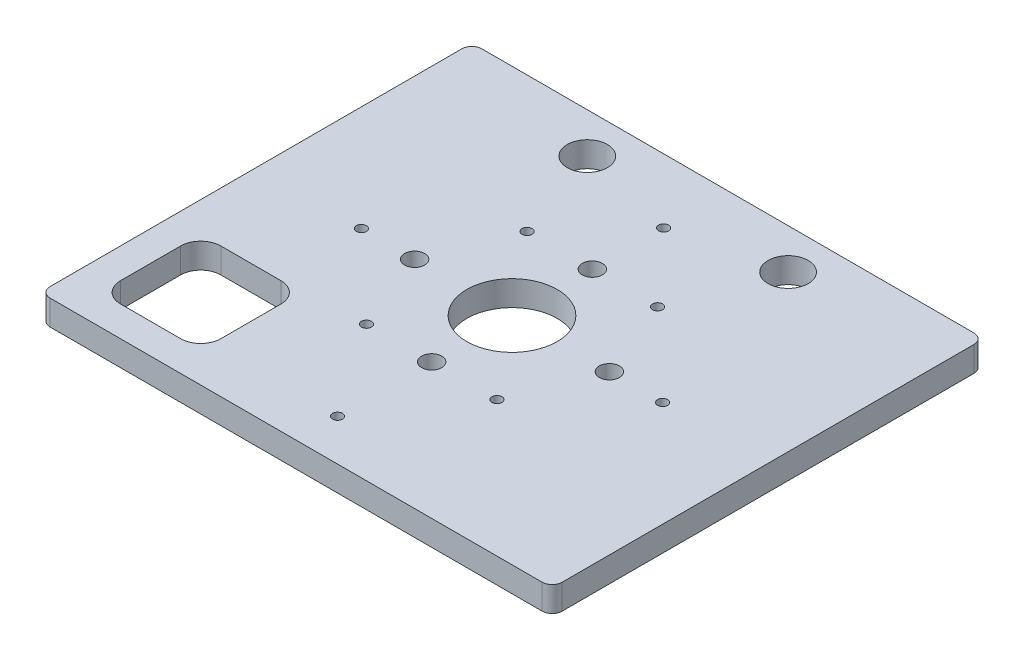
ISO-10303-21;
HEADER;
FILE_DESCRIPTION(('STEP AP214'),'2;1');
FILE_NAME('part.step','',(''),(''),'','','');
FILE_SCHEMA(('AUTOMOTIVE_DESIGN { 1 0 10303 214 1 1 1 1 }'));
ENDSEC;
DATA;
#1=APPLICATION_CONTEXT('core data for automotive mechanical design processes');
#2=APPLICATION_PROTOCOL_DEFINITION('international standard','automotive_design',2000,#1);
#3=PRODUCT_CONTEXT('',#1,'mechanical');
#4=PRODUCT('Part','Part','',(#3));
#5=PRODUCT_RELATED_PRODUCT_CATEGORY('part','',(#4));
#6=PRODUCT_DEFINITION_FORMATION('','',#4);
#7=PRODUCT_DEFINITION_CONTEXT('part definition',#1,'design');
#8=PRODUCT_DEFINITION('design','',#6,#7);
#9=PRODUCT_DEFINITION_SHAPE('','',#8);
#10=(LENGTH_UNIT() NAMED_UNIT(*) SI_UNIT(.MILLI.,.METRE.));
#11=(NAMED_UNIT(*) PLANE_ANGLE_UNIT() SI_UNIT($,.RADIAN.));
#12=(NAMED_UNIT(*) SI_UNIT($,.STERADIAN.) SOLID_ANGLE_UNIT());
#13=UNCERTAINTY_MEASURE_WITH_UNIT(LENGTH_MEASURE(1.E-05),#10,'distance_accuracy_value','');
#14=(GEOMETRIC_REPRESENTATION_CONTEXT(3) GLOBAL_UNCERTAINTY_ASSIGNED_CONTEXT((#13)) GLOBAL_UNIT_ASSIGNED_CONTEXT((#10,
#11,#12)) REPRESENTATION_CONTEXT('',''));
#15=CARTESIAN_POINT('',(0.,0.,0.));
#16=DIRECTION('',(0.,0.,1.));
#17=DIRECTION('',(1.,0.,0.));
#18=AXIS2_PLACEMENT_3D('',#15,#16,#17);
#19=CARTESIAN_POINT('',(0.,2.5,8.5));
#20=DIRECTION('',(0.,0.,-1.));
#21=DIRECTION('',(-1.,0.,0.));
#22=AXIS2_PLACEMENT_3D('',#19,#20,#21);
#23=PLANE('',#22);
#24=DIRECTION('',(1.,0.,0.));
#25=VECTOR('',#24,1.);
#26=CARTESIAN_POINT('',(0.,0.,8.5));
#27=LINE('',#26,#25);
#28=CARTESIAN_POINT('',(-20.5,0.,8.5));
#29=VERTEX_POINT('',#28);
#30=CARTESIAN_POINT('',(-14.5,0.,8.5));
#31=VERTEX_POINT('',#30);
#32=EDGE_CURVE('E173',#29,#31,#27,.T.);
#33=ORIENTED_EDGE('',*,*,#32,.T.);
#34=DIRECTION('',(0.,-1.,0.));
#35=VECTOR('',#34,1.);
#36=CARTESIAN_POINT('',(-14.5,2.5,8.5));
#37=LINE('',#36,#35);
#38=CARTESIAN_POINT('',(-14.5,2.5,8.5));
#39=VERTEX_POINT('',#38);
#40=EDGE_CURVE('E154',#39,#31,#37,.T.);
#41=ORIENTED_EDGE('',*,*,#40,.F.);
#42=DIRECTION('',(1.,0.,0.));
#43=VECTOR('',#42,1.);
#44=CARTESIAN_POINT('',(0.,2.5,8.5));
#45=LINE('',#44,#43);
#46=CARTESIAN_POINT('',(-20.5,2.5,8.5));
#47=VERTEX_POINT('',#46);
#48=EDGE_CURVE('E161',#47,#39,#45,.T.);
#49=ORIENTED_EDGE('',*,*,#48,.F.);
#50=DIRECTION('',(0.,-1.,0.));
#51=VECTOR('',#50,1.);
#52=CARTESIAN_POINT('',(-20.5,2.5,8.5));
#53=LINE('',#52,#51);
#54=EDGE_CURVE('E301',#47,#29,#53,.T.);
#55=ORIENTED_EDGE('',*,*,#54,.T.);
#56=EDGE_LOOP('',(#33,#41,#49,#55));
#57=FACE_BOUND('',#56,.T.);
#58=ADVANCED_FACE('F35',(#57),#23,.F.);
#59=CARTESIAN_POINT('',(-14.5,2.5,10.5));
#60=DIRECTION('',(0.,-1.,0.));
#61=DIRECTION('',(0.,0.,-1.));
#62=AXIS2_PLACEMENT_3D('',#59,#60,#61);
#63=CYLINDRICAL_SURFACE('',#62,2.);
#64=CARTESIAN_POINT('',(-14.5,0.,10.5));
#65=DIRECTION('',(0.,1.,0.));
#66=DIRECTION('',(0.,0.,1.));
#67=AXIS2_PLACEMENT_3D('',#64,#65,#66);
#68=CIRCLE('',#67,2.);
#69=CARTESIAN_POINT('',(-12.5,0.,10.5));
#70=VERTEX_POINT('',#69);
#71=EDGE_CURVE('E257',#31,#70,#68,.F.);
#72=ORIENTED_EDGE('',*,*,#71,.T.);
#73=DIRECTION('',(0.,-1.,0.));
#74=VECTOR('',#73,1.);
#75=CARTESIAN_POINT('',(-12.5,2.5,10.5));
#76=LINE('',#75,#74);
#77=CARTESIAN_POINT('',(-12.5,2.5,10.5));
#78=VERTEX_POINT('',#77);
#79=EDGE_CURVE('E156',#78,#70,#76,.T.);
#80=ORIENTED_EDGE('',*,*,#79,.F.);
#81=CARTESIAN_POINT('',(-14.5,2.5,10.5));
#82=DIRECTION('',(0.,1.,0.));
#83=DIRECTION('',(0.,0.,1.));
#84=AXIS2_PLACEMENT_3D('',#81,#82,#83);
#85=CIRCLE('',#84,2.);
#86=EDGE_CURVE('E149',#39,#78,#85,.F.);
#87=ORIENTED_EDGE('',*,*,#86,.F.);
#88=ORIENTED_EDGE('',*,*,#40,.T.);
#89=EDGE_LOOP('',(#72,#80,#87,#88));
#90=FACE_BOUND('',#89,.T.);
#91=ADVANCED_FACE('F152',(#90),#63,.F.);
#92=CARTESIAN_POINT('',(-12.5,2.5,0.));
#93=DIRECTION('',(-1.,0.,0.));
#94=DIRECTION('',(0.,0.,1.));
#95=AXIS2_PLACEMENT_3D('',#92,#93,#94);
#96=PLANE('',#95);
#97=DIRECTION('',(0.,0.,-1.));
#98=VECTOR('',#97,1.);
#99=CARTESIAN_POINT('',(-12.5,0.,0.));
#100=LINE('',#99,#98);
#101=CARTESIAN_POINT('',(-12.5,0.,16.5));
#102=VERTEX_POINT('',#101);
#103=EDGE_CURVE('E259',#102,#70,#100,.T.);
#104=ORIENTED_EDGE('',*,*,#103,.F.);
#105=DIRECTION('',(0.,-1.,0.));
#106=VECTOR('',#105,1.);
#107=CARTESIAN_POINT('',(-12.5,2.5,16.5));
#108=LINE('',#107,#106);
#109=CARTESIAN_POINT('',(-12.5,2.5,16.5));
#110=VERTEX_POINT('',#109);
#111=EDGE_CURVE('E178',#110,#102,#108,.T.);
#112=ORIENTED_EDGE('',*,*,#111,.F.);
#113=DIRECTION('',(0.,0.,-1.));
#114=VECTOR('',#113,1.);
#115=CARTESIAN_POINT('',(-12.5,2.5,0.));
#116=LINE('',#115,#114);
#117=EDGE_CURVE('E160',#110,#78,#116,.T.);
#118=ORIENTED_EDGE('',*,*,#117,.T.);
#119=ORIENTED_EDGE('',*,*,#79,.T.);
#120=EDGE_LOOP('',(#104,#112,#118,#119));
#121=FACE_BOUND('',#120,.T.);
#122=ADVANCED_FACE('F324',(#121),#96,.T.);
#123=CARTESIAN_POINT('',(-14.5,2.5,16.5));
#124=DIRECTION('',(0.,-1.,0.));
#125=DIRECTION('',(0.,0.,-1.));
#126=AXIS2_PLACEMENT_3D('',#123,#124,#125);
#127=CYLINDRICAL_SURFACE('',#126,2.);
#128=CARTESIAN_POINT('',(-14.5,0.,16.5));
#129=DIRECTION('',(0.,1.,0.));
#130=DIRECTION('',(0.,0.,1.));
#131=AXIS2_PLACEMENT_3D('',#128,#129,#130);
#132=CIRCLE('',#131,2.);
#133=CARTESIAN_POINT('',(-14.5,0.,18.5));
#134=VERTEX_POINT('',#133);
#135=EDGE_CURVE('E262',#102,#134,#132,.F.);
#136=ORIENTED_EDGE('',*,*,#135,.T.);
#137=DIRECTION('',(0.,-1.,0.));
#138=VECTOR('',#137,1.);
#139=CARTESIAN_POINT('',(-14.5,2.5,18.5));
#140=LINE('',#139,#138);
#141=CARTESIAN_POINT('',(-14.5,2.5,18.5));
#142=VERTEX_POINT('',#141);
#143=EDGE_CURVE('E311',#142,#134,#140,.T.);
#144=ORIENTED_EDGE('',*,*,#143,.F.);
#145=CARTESIAN_POINT('',(-14.5,2.5,16.5));
#146=DIRECTION('',(0.,1.,0.));
#147=DIRECTION('',(0.,0.,1.));
#148=AXIS2_PLACEMENT_3D('',#145,#146,#147);
#149=CIRCLE('',#148,2.);
#150=EDGE_CURVE('E317',#110,#142,#149,.F.);
#151=ORIENTED_EDGE('',*,*,#150,.F.);
#152=ORIENTED_EDGE('',*,*,#111,.T.);
#153=EDGE_LOOP('',(#136,#144,#151,#152));
#154=FACE_BOUND('',#153,.T.);
#155=ADVANCED_FACE('F315',(#154),#127,.F.);
#156=CARTESIAN_POINT('',(0.,2.5,18.5));
#157=DIRECTION('',(0.,0.,-1.));
#158=DIRECTION('',(-1.,0.,0.));
#159=AXIS2_PLACEMENT_3D('',#156,#157,#158);
#160=PLANE('',#159);
#161=DIRECTION('',(1.,0.,0.));
#162=VECTOR('',#161,1.);
#163=CARTESIAN_POINT('',(0.,0.,18.5));
#164=LINE('',#163,#162);
#165=CARTESIAN_POINT('',(-20.5,0.,18.5));
#166=VERTEX_POINT('',#165);
#167=EDGE_CURVE('E265',#166,#134,#164,.T.);
#168=ORIENTED_EDGE('',*,*,#167,.F.);
#169=DIRECTION('',(0.,-1.,0.));
#170=VECTOR('',#169,1.);
#171=CARTESIAN_POINT('',(-20.5,2.5,18.5));
#172=LINE('',#171,#170);
#173=CARTESIAN_POINT('',(-20.5,2.5,18.5));
#174=VERTEX_POINT('',#173);
#175=EDGE_CURVE('E309',#174,#166,#172,.T.);
#176=ORIENTED_EDGE('',*,*,#175,.F.);
#177=DIRECTION('',(1.,0.,0.));
#178=VECTOR('',#177,1.);
#179=CARTESIAN_POINT('',(0.,2.5,18.5));
#180=LINE('',#179,#178);
#181=EDGE_CURVE('E340',#174,#142,#180,.T.);
#182=ORIENTED_EDGE('',*,*,#181,.T.);
#183=ORIENTED_EDGE('',*,*,#143,.T.);
#184=EDGE_LOOP('',(#168,#176,#182,#183));
#185=FACE_BOUND('',#184,.T.);
#186=ADVANCED_FACE('F336',(#185),#160,.T.);
#187=CARTESIAN_POINT('',(-20.5,2.5,16.5));
#188=DIRECTION('',(0.,-1.,0.));
#189=DIRECTION('',(0.,0.,-1.));
#190=AXIS2_PLACEMENT_3D('',#187,#188,#189);
#191=CYLINDRICAL_SURFACE('',#190,2.);
#192=CARTESIAN_POINT('',(-20.5,0.,16.5));
#193=DIRECTION('',(0.,1.,0.));
#194=DIRECTION('',(0.,0.,1.));
#195=AXIS2_PLACEMENT_3D('',#192,#193,#194);
#196=CIRCLE('',#195,2.);
#197=CARTESIAN_POINT('',(-22.5,0.,16.5));
#198=VERTEX_POINT('',#197);
#199=EDGE_CURVE('E268',#166,#198,#196,.F.);
#200=ORIENTED_EDGE('',*,*,#199,.T.);
#201=DIRECTION('',(0.,-1.,0.));
#202=VECTOR('',#201,1.);
#203=CARTESIAN_POINT('',(-22.5,2.5,16.5));
#204=LINE('',#203,#202);
#205=CARTESIAN_POINT('',(-22.5,2.5,16.5));
#206=VERTEX_POINT('',#205);
#207=EDGE_CURVE('E306',#206,#198,#204,.T.);
#208=ORIENTED_EDGE('',*,*,#207,.F.);
#209=CARTESIAN_POINT('',(-20.5,2.5,16.5));
#210=DIRECTION('',(0.,1.,0.));
#211=DIRECTION('',(0.,0.,1.));
#212=AXIS2_PLACEMENT_3D('',#209,#210,#211);
#213=CIRCLE('',#212,2.);
#214=EDGE_CURVE('E341',#174,#206,#213,.F.);
#215=ORIENTED_EDGE('',*,*,#214,.F.);
#216=ORIENTED_EDGE('',*,*,#175,.T.);
#217=EDGE_LOOP('',(#200,#208,#215,#216));
#218=FACE_BOUND('',#217,.T.);
#219=ADVANCED_FACE('F707',(#218),#191,.F.);
#220=CARTESIAN_POINT('',(-22.5,2.5,0.));
#221=DIRECTION('',(-1.,0.,0.));
#222=DIRECTION('',(0.,0.,1.));
#223=AXIS2_PLACEMENT_3D('',#220,#221,#222);
#224=PLANE('',#223);
#225=DIRECTION('',(0.,0.,-1.));
#226=VECTOR('',#225,1.);
#227=CARTESIAN_POINT('',(-22.5,0.,0.));
#228=LINE('',#227,#226);
#229=CARTESIAN_POINT('',(-22.5,0.,10.5));
#230=VERTEX_POINT('',#229);
#231=EDGE_CURVE('E270',#198,#230,#228,.T.);
#232=ORIENTED_EDGE('',*,*,#231,.T.);
#233=DIRECTION('',(0.,-1.,0.));
#234=VECTOR('',#233,1.);
#235=CARTESIAN_POINT('',(-22.5,2.5,10.5));
#236=LINE('',#235,#234);
#237=CARTESIAN_POINT('',(-22.5,2.5,10.5));
#238=VERTEX_POINT('',#237);
#239=EDGE_CURVE('E303',#238,#230,#236,.T.);
#240=ORIENTED_EDGE('',*,*,#239,.F.);
#241=DIRECTION('',(0.,0.,-1.));
#242=VECTOR('',#241,1.);
#243=CARTESIAN_POINT('',(-22.5,2.5,0.));
#244=LINE('',#243,#242);
#245=EDGE_CURVE('E343',#206,#238,#244,.T.);
#246=ORIENTED_EDGE('',*,*,#245,.F.);
#247=ORIENTED_EDGE('',*,*,#207,.T.);
#248=EDGE_LOOP('',(#232,#240,#246,#247));
#249=FACE_BOUND('',#248,.T.);
#250=ADVANCED_FACE('F332',(#249),#224,.F.);
#251=CARTESIAN_POINT('',(0.,2.5,-21.5));
#252=DIRECTION('',(0.,0.,-1.));
#253=DIRECTION('',(-1.,0.,0.));
#254=AXIS2_PLACEMENT_3D('',#251,#252,#253);
#255=PLANE('',#254);
#256=DIRECTION('',(1.,0.,0.));
#257=VECTOR('',#256,1.);
#258=CARTESIAN_POINT('',(0.,2.5,-21.5));
#259=LINE('',#258,#257);
#260=CARTESIAN_POINT('',(-24.5,2.5,-21.5));
#261=VERTEX_POINT('',#260);
#262=CARTESIAN_POINT('',(24.5,2.5,-21.5));
#263=VERTEX_POINT('',#262);
#264=EDGE_CURVE('E216',#261,#263,#259,.T.);
#265=ORIENTED_EDGE('',*,*,#264,.T.);
#266=DIRECTION('',(0.,-1.,0.));
#267=VECTOR('',#266,1.);
#268=CARTESIAN_POINT('',(24.5,0.,-21.5));
#269=LINE('',#268,#267);
#270=CARTESIAN_POINT('',(24.5,0.,-21.5));
#271=VERTEX_POINT('',#270);
#272=EDGE_CURVE('E206',#263,#271,#269,.T.);
#273=ORIENTED_EDGE('',*,*,#272,.T.);
#274=DIRECTION('',(1.,0.,0.));
#275=VECTOR('',#274,1.);
#276=CARTESIAN_POINT('',(0.,0.,-21.5));
#277=LINE('',#276,#275);
#278=CARTESIAN_POINT('',(-24.5,0.,-21.5));
#279=VERTEX_POINT('',#278);
#280=EDGE_CURVE('E214',#279,#271,#277,.T.);
#281=ORIENTED_EDGE('',*,*,#280,.F.);
#282=DIRECTION('',(0.,-1.,0.));
#283=VECTOR('',#282,1.);
#284=CARTESIAN_POINT('',(-24.5,2.5,-21.5));
#285=LINE('',#284,#283);
#286=EDGE_CURVE('E204',#279,#261,#285,.F.);
#287=ORIENTED_EDGE('',*,*,#286,.T.);
#288=EDGE_LOOP('',(#265,#273,#281,#287));
#289=FACE_BOUND('',#288,.T.);
#290=ADVANCED_FACE('F213',(#289),#255,.T.);
#291=CARTESIAN_POINT('',(-25.5,2.5,0.));
#292=DIRECTION('',(-1.,0.,0.));
#293=DIRECTION('',(0.,0.,1.));
#294=AXIS2_PLACEMENT_3D('',#291,#292,#293);
#295=PLANE('',#294);
#296=DIRECTION('',(0.,0.,-1.));
#297=VECTOR('',#296,1.);
#298=CARTESIAN_POINT('',(-25.5,2.5,0.));
#299=LINE('',#298,#297);
#300=CARTESIAN_POINT('',(-25.5,2.5,20.5));
#301=VERTEX_POINT('',#300);
#302=CARTESIAN_POINT('',(-25.5,2.5,-20.5));
#303=VERTEX_POINT('',#302);
#304=EDGE_CURVE('E451',#301,#303,#299,.T.);
#305=ORIENTED_EDGE('',*,*,#304,.T.);
#306=DIRECTION('',(0.,-1.,0.));
#307=VECTOR('',#306,1.);
#308=CARTESIAN_POINT('',(-25.5,2.5,-20.5));
#309=LINE('',#308,#307);
#310=CARTESIAN_POINT('',(-25.5,0.,-20.5));
#311=VERTEX_POINT('',#310);
#312=EDGE_CURVE('E11',#303,#311,#309,.T.);
#313=ORIENTED_EDGE('',*,*,#312,.T.);
#314=DIRECTION('',(0.,0.,-1.));
#315=VECTOR('',#314,1.);
#316=CARTESIAN_POINT('',(-25.5,0.,0.));
#317=LINE('',#316,#315);
#318=CARTESIAN_POINT('',(-25.5,0.,20.5));
#319=VERTEX_POINT('',#318);
#320=EDGE_CURVE('E225',#319,#311,#317,.T.);
#321=ORIENTED_EDGE('',*,*,#320,.F.);
#322=DIRECTION('',(0.,-1.,0.));
#323=VECTOR('',#322,1.);
#324=CARTESIAN_POINT('',(-25.5,2.5,20.5));
#325=LINE('',#324,#323);
#326=EDGE_CURVE('E43',#319,#301,#325,.F.);
#327=ORIENTED_EDGE('',*,*,#326,.T.);
#328=EDGE_LOOP('',(#305,#313,#321,#327));
#329=FACE_BOUND('',#328,.T.);
#330=ADVANCED_FACE('F429',(#329),#295,.T.);
#331=CARTESIAN_POINT('',(0.,2.5,21.5));
#332=DIRECTION('',(0.,0.,-1.));
#333=DIRECTION('',(-1.,0.,0.));
#334=AXIS2_PLACEMENT_3D('',#331,#332,#333);
#335=PLANE('',#334);
#336=DIRECTION('',(1.,0.,0.));
#337=VECTOR('',#336,1.);
#338=CARTESIAN_POINT('',(0.,0.,21.5));
#339=LINE('',#338,#337);
#340=CARTESIAN_POINT('',(-24.5,0.,21.5));
#341=VERTEX_POINT('',#340);
#342=CARTESIAN_POINT('',(24.5,0.,21.5));
#343=VERTEX_POINT('',#342);
#344=EDGE_CURVE('E228',#341,#343,#339,.T.);
#345=ORIENTED_EDGE('',*,*,#344,.T.);
#346=DIRECTION('',(0.,-1.,0.));
#347=VECTOR('',#346,1.);
#348=CARTESIAN_POINT('',(24.5,2.5,21.5));
#349=LINE('',#348,#347);
#350=CARTESIAN_POINT('',(24.5,2.5,21.5));
#351=VERTEX_POINT('',#350);
#352=EDGE_CURVE('E195',#343,#351,#349,.F.);
#353=ORIENTED_EDGE('',*,*,#352,.T.);
#354=DIRECTION('',(1.,0.,0.));
#355=VECTOR('',#354,1.);
#356=CARTESIAN_POINT('',(0.,2.5,21.5));
#357=LINE('',#356,#355);
#358=CARTESIAN_POINT('',(-24.5,2.5,21.5));
#359=VERTEX_POINT('',#358);
#360=EDGE_CURVE('E458',#359,#351,#357,.T.);
#361=ORIENTED_EDGE('',*,*,#360,.F.);
#362=DIRECTION('',(0.,-1.,0.));
#363=VECTOR('',#362,1.);
#364=CARTESIAN_POINT('',(-24.5,0.,21.5));
#365=LINE('',#364,#363);
#366=EDGE_CURVE('E192',#359,#341,#365,.T.);
#367=ORIENTED_EDGE('',*,*,#366,.T.);
#368=EDGE_LOOP('',(#345,#353,#361,#367));
#369=FACE_BOUND('',#368,.T.);
#370=ADVANCED_FACE('F425',(#369),#335,.F.);
#371=CARTESIAN_POINT('',(6.5,2.5,-8.));
#372=DIRECTION('',(0.,-1.,0.));
#373=DIRECTION('',(0.,0.,-1.));
#374=AXIS2_PLACEMENT_3D('',#371,#372,#373);
#375=CYLINDRICAL_SURFACE('',#374,0.5);
#376=CARTESIAN_POINT('',(6.5,2.5,-8.));
#377=DIRECTION('',(0.,1.,0.));
#378=DIRECTION('',(0.,0.,1.));
#379=AXIS2_PLACEMENT_3D('',#376,#377,#378);
#380=CIRCLE('',#379,0.5);
#381=CARTESIAN_POINT('',(6.5,2.5,-7.5));
#382=VERTEX_POINT('',#381);
#383=EDGE_CURVE('E368',#382,#382,#380,.T.);
#384=ORIENTED_EDGE('',*,*,#383,.T.);
#385=EDGE_LOOP('',(#384));
#386=FACE_BOUND('',#385,.T.);
#387=CARTESIAN_POINT('',(6.5,0.,-8.));
#388=DIRECTION('',(0.,1.,0.));
#389=DIRECTION('',(0.,0.,1.));
#390=AXIS2_PLACEMENT_3D('',#387,#388,#389);
#391=CIRCLE('',#390,0.5);
#392=CARTESIAN_POINT('',(6.5,0.,-7.5));
#393=VERTEX_POINT('',#392);
#394=EDGE_CURVE('E294',#393,#393,#391,.T.);
#395=ORIENTED_EDGE('',*,*,#394,.F.);
#396=EDGE_LOOP('',(#395));
#397=FACE_BOUND('',#396,.T.);
#398=ADVANCED_FACE('F428',(#386,#397),#375,.F.);
#399=CARTESIAN_POINT('',(0.,2.5,-15.1037191085249));
#400=DIRECTION('',(0.,-1.,0.));
#401=DIRECTION('',(0.,0.,-1.));
#402=AXIS2_PLACEMENT_3D('',#399,#400,#401);
#403=CYLINDRICAL_SURFACE('',#402,0.5);
#404=CARTESIAN_POINT('',(0.,2.5,-15.1037191085249));
#405=DIRECTION('',(0.,1.,0.));
#406=DIRECTION('',(0.,0.,1.));
#407=AXIS2_PLACEMENT_3D('',#404,#405,#406);
#408=CIRCLE('',#407,0.5);
#409=CARTESIAN_POINT('',(0.,2.5,-14.6037191085249));
#410=VERTEX_POINT('',#409);
#411=EDGE_CURVE('E365',#410,#410,#408,.T.);
#412=ORIENTED_EDGE('',*,*,#411,.T.);
#413=EDGE_LOOP('',(#412));
#414=FACE_BOUND('',#413,.T.);
#415=CARTESIAN_POINT('',(0.,0.,-15.1037191085249));
#416=DIRECTION('',(0.,1.,0.));
#417=DIRECTION('',(0.,0.,1.));
#418=AXIS2_PLACEMENT_3D('',#415,#416,#417);
#419=CIRCLE('',#418,0.5);
#420=CARTESIAN_POINT('',(0.,0.,-14.6037191085249));
#421=VERTEX_POINT('',#420);
#422=EDGE_CURVE('E291',#421,#421,#419,.T.);
#423=ORIENTED_EDGE('',*,*,#422,.F.);
#424=EDGE_LOOP('',(#423));
#425=FACE_BOUND('',#424,.T.);
#426=ADVANCED_FACE('F683',(#414,#425),#403,.F.);
#427=CARTESIAN_POINT('',(15.,2.5,0.));
#428=DIRECTION('',(0.,-1.,0.));
#429=DIRECTION('',(0.,0.,-1.));
#430=AXIS2_PLACEMENT_3D('',#427,#428,#429);
#431=CYLINDRICAL_SURFACE('',#430,0.500000000000001);
#432=CARTESIAN_POINT('',(15.,2.5,0.));
#433=DIRECTION('',(0.,1.,0.));
#434=DIRECTION('',(0.,0.,1.));
#435=AXIS2_PLACEMENT_3D('',#432,#433,#434);
#436=CIRCLE('',#435,0.500000000000001);
#437=CARTESIAN_POINT('',(15.,2.5,0.500000000000001));
#438=VERTEX_POINT('',#437);
#439=EDGE_CURVE('E362',#438,#438,#436,.T.);
#440=ORIENTED_EDGE('',*,*,#439,.T.);
#441=EDGE_LOOP('',(#440));
#442=FACE_BOUND('',#441,.T.);
#443=CARTESIAN_POINT('',(15.,0.,0.));
#444=DIRECTION('',(0.,1.,0.));
#445=DIRECTION('',(0.,0.,1.));
#446=AXIS2_PLACEMENT_3D('',#443,#444,#445);
#447=CIRCLE('',#446,0.500000000000001);
#448=CARTESIAN_POINT('',(15.,0.,0.500000000000001));
#449=VERTEX_POINT('',#448);
#450=EDGE_CURVE('E288',#449,#449,#447,.T.);
#451=ORIENTED_EDGE('',*,*,#450,.F.);
#452=EDGE_LOOP('',(#451));
#453=FACE_BOUND('',#452,.T.);
#454=ADVANCED_FACE('F673',(#442,#453),#431,.F.);
#455=CARTESIAN_POINT('',(10.,2.5,-17.5));
#456=DIRECTION('',(0.,-1.,0.));
#457=DIRECTION('',(0.,0.,-1.));
#458=AXIS2_PLACEMENT_3D('',#455,#456,#457);
#459=CYLINDRICAL_SURFACE('',#458,2.);
#460=CARTESIAN_POINT('',(10.,2.5,-17.5));
#461=DIRECTION('',(0.,1.,0.));
#462=DIRECTION('',(0.,0.,1.));
#463=AXIS2_PLACEMENT_3D('',#460,#461,#462);
#464=CIRCLE('',#463,2.);
#465=CARTESIAN_POINT('',(10.,2.5,-15.5));
#466=VERTEX_POINT('',#465);
#467=EDGE_CURVE('E359',#466,#466,#464,.F.);
#468=ORIENTED_EDGE('',*,*,#467,.F.);
#469=EDGE_LOOP('',(#468));
#470=FACE_BOUND('',#469,.T.);
#471=CARTESIAN_POINT('',(10.,0.,-17.5));
#472=DIRECTION('',(0.,1.,0.));
#473=DIRECTION('',(0.,0.,1.));
#474=AXIS2_PLACEMENT_3D('',#471,#472,#473);
#475=CIRCLE('',#474,2.);
#476=CARTESIAN_POINT('',(10.,0.,-15.5));
#477=VERTEX_POINT('',#476);
#478=EDGE_CURVE('E285',#477,#477,#475,.F.);
#479=ORIENTED_EDGE('',*,*,#478,.T.);
#480=EDGE_LOOP('',(#479));
#481=FACE_BOUND('',#480,.T.);
#482=ADVANCED_FACE('F663',(#470,#481),#459,.F.);
#483=CARTESIAN_POINT('',(-10.,2.5,-17.5));
#484=DIRECTION('',(0.,-1.,0.));
#485=DIRECTION('',(0.,0.,-1.));
#486=AXIS2_PLACEMENT_3D('',#483,#484,#485);
#487=CYLINDRICAL_SURFACE('',#486,2.);
#488=CARTESIAN_POINT('',(-10.,2.5,-17.5));
#489=DIRECTION('',(0.,1.,0.));
#490=DIRECTION('',(0.,0.,1.));
#491=AXIS2_PLACEMENT_3D('',#488,#489,#490);
#492=CIRCLE('',#491,2.);
#493=CARTESIAN_POINT('',(-10.,2.5,-15.5));
#494=VERTEX_POINT('',#493);
#495=EDGE_CURVE('E356',#494,#494,#492,.T.);
#496=ORIENTED_EDGE('',*,*,#495,.T.);
#497=EDGE_LOOP('',(#496));
#498=FACE_BOUND('',#497,.T.);
#499=CARTESIAN_POINT('',(-10.,0.,-17.5));
#500=DIRECTION('',(0.,1.,0.));
#501=DIRECTION('',(0.,0.,1.));
#502=AXIS2_PLACEMENT_3D('',#499,#500,#501);
#503=CIRCLE('',#502,2.);
#504=CARTESIAN_POINT('',(-10.,0.,-15.5));
#505=VERTEX_POINT('',#504);
#506=EDGE_CURVE('E282',#505,#505,#503,.T.);
#507=ORIENTED_EDGE('',*,*,#506,.F.);
#508=EDGE_LOOP('',(#507));
#509=FACE_BOUND('',#508,.T.);
#510=ADVANCED_FACE('F653',(#498,#509),#487,.F.);
#511=CARTESIAN_POINT('',(9.7,2.5,0.));
#512=DIRECTION('',(0.,-1.,0.));
#513=DIRECTION('',(0.,0.,-1.));
#514=AXIS2_PLACEMENT_3D('',#511,#512,#513);
#515=CYLINDRICAL_SURFACE('',#514,1.);
#516=CARTESIAN_POINT('',(9.7,2.5,0.));
#517=DIRECTION('',(0.,1.,0.));
#518=DIRECTION('',(0.,0.,1.));
#519=AXIS2_PLACEMENT_3D('',#516,#517,#518);
#520=CIRCLE('',#519,1.);
#521=CARTESIAN_POINT('',(9.7,2.5,1.));
#522=VERTEX_POINT('',#521);
#523=EDGE_CURVE('E353',#522,#522,#520,.T.);
#524=ORIENTED_EDGE('',*,*,#523,.T.);
#525=EDGE_LOOP('',(#524));
#526=FACE_BOUND('',#525,.T.);
#527=CARTESIAN_POINT('',(9.7,0.,0.));
#528=DIRECTION('',(0.,1.,0.));
#529=DIRECTION('',(0.,0.,1.));
#530=AXIS2_PLACEMENT_3D('',#527,#528,#529);
#531=CIRCLE('',#530,1.);
#532=CARTESIAN_POINT('',(9.7,0.,1.));
#533=VERTEX_POINT('',#532);
#534=EDGE_CURVE('E279',#533,#533,#531,.T.);
#535=ORIENTED_EDGE('',*,*,#534,.F.);
#536=EDGE_LOOP('',(#535));
#537=FACE_BOUND('',#536,.T.);
#538=ADVANCED_FACE('F643',(#526,#537),#515,.F.);
#539=CARTESIAN_POINT('',(0.,2.5,-8.));
#540=DIRECTION('',(0.,-1.,0.));
#541=DIRECTION('',(0.,0.,-1.));
#542=AXIS2_PLACEMENT_3D('',#539,#540,#541);
#543=CYLINDRICAL_SURFACE('',#542,1.);
#544=CARTESIAN_POINT('',(0.,2.5,-8.));
#545=DIRECTION('',(0.,1.,0.));
#546=DIRECTION('',(0.,0.,1.));
#547=AXIS2_PLACEMENT_3D('',#544,#545,#546);
#548=CIRCLE('',#547,1.);
#549=CARTESIAN_POINT('',(0.,2.5,-7.));
#550=VERTEX_POINT('',#549);
#551=EDGE_CURVE('E350',#550,#550,#548,.T.);
#552=ORIENTED_EDGE('',*,*,#551,.T.);
#553=EDGE_LOOP('',(#552));
#554=FACE_BOUND('',#553,.T.);
#555=CARTESIAN_POINT('',(0.,0.,-8.));
#556=DIRECTION('',(0.,1.,0.));
#557=DIRECTION('',(0.,0.,1.));
#558=AXIS2_PLACEMENT_3D('',#555,#556,#557);
#559=CIRCLE('',#558,1.);
#560=CARTESIAN_POINT('',(0.,0.,-7.));
#561=VERTEX_POINT('',#560);
#562=EDGE_CURVE('E276',#561,#561,#559,.T.);
#563=ORIENTED_EDGE('',*,*,#562,.F.);
#564=EDGE_LOOP('',(#563));
#565=FACE_BOUND('',#564,.T.);
#566=ADVANCED_FACE('F634',(#554,#565),#543,.F.);
#567=CARTESIAN_POINT('',(-20.5,2.5,10.5));
#568=DIRECTION('',(0.,-1.,0.));
#569=DIRECTION('',(0.,0.,-1.));
#570=AXIS2_PLACEMENT_3D('',#567,#568,#569);
#571=CYLINDRICAL_SURFACE('',#570,2.);
#572=CARTESIAN_POINT('',(-20.5,0.,10.5));
#573=DIRECTION('',(0.,1.,0.));
#574=DIRECTION('',(0.,0.,1.));
#575=AXIS2_PLACEMENT_3D('',#572,#573,#574);
#576=CIRCLE('',#575,2.);
#577=EDGE_CURVE('E273',#29,#230,#576,.T.);
#578=ORIENTED_EDGE('',*,*,#577,.F.);
#579=ORIENTED_EDGE('',*,*,#54,.F.);
#580=CARTESIAN_POINT('',(-20.5,2.5,10.5));
#581=DIRECTION('',(0.,1.,0.));
#582=DIRECTION('',(0.,0.,1.));
#583=AXIS2_PLACEMENT_3D('',#580,#581,#582);
#584=CIRCLE('',#583,2.);
#585=EDGE_CURVE('E168',#47,#238,#584,.T.);
#586=ORIENTED_EDGE('',*,*,#585,.T.);
#587=ORIENTED_EDGE('',*,*,#239,.T.);
#588=EDGE_LOOP('',(#578,#579,#586,#587));
#589=FACE_BOUND('',#588,.T.);
#590=ADVANCED_FACE('F328',(#589),#571,.F.);
#591=CARTESIAN_POINT('',(-15.,2.5,0.));
#592=DIRECTION('',(0.,-1.,0.));
#593=DIRECTION('',(0.,0.,-1.));
#594=AXIS2_PLACEMENT_3D('',#591,#592,#593);
#595=CYLINDRICAL_SURFACE('',#594,0.500000000000001);
#596=CARTESIAN_POINT('',(-15.,2.5,0.));
#597=DIRECTION('',(0.,1.,0.));
#598=DIRECTION('',(0.,0.,1.));
#599=AXIS2_PLACEMENT_3D('',#596,#597,#598);
#600=CIRCLE('',#599,0.500000000000001);
#601=CARTESIAN_POINT('',(-15.,2.5,0.500000000000001));
#602=VERTEX_POINT('',#601);
#603=EDGE_CURVE('E170',#602,#602,#600,.T.);
#604=ORIENTED_EDGE('',*,*,#603,.T.);
#605=EDGE_LOOP('',(#604));
#606=FACE_BOUND('',#605,.T.);
#607=CARTESIAN_POINT('',(-15.,0.,0.));
#608=DIRECTION('',(0.,1.,0.));
#609=DIRECTION('',(0.,0.,1.));
#610=AXIS2_PLACEMENT_3D('',#607,#608,#609);
#611=CIRCLE('',#610,0.500000000000001);
#612=CARTESIAN_POINT('',(-15.,0.,0.500000000000001));
#613=VERTEX_POINT('',#612);
#614=EDGE_CURVE('E253',#613,#613,#611,.T.);
#615=ORIENTED_EDGE('',*,*,#614,.F.);
#616=EDGE_LOOP('',(#615));
#617=FACE_BOUND('',#616,.T.);
#618=ADVANCED_FACE('F397',(#606,#617),#595,.F.);
#619=CARTESIAN_POINT('',(0.,2.5,17.3753335223877));
#620=DIRECTION('',(0.,-1.,0.));
#621=DIRECTION('',(0.,0.,-1.));
#622=AXIS2_PLACEMENT_3D('',#619,#620,#621);
#623=CYLINDRICAL_SURFACE('',#622,0.5);
#624=CARTESIAN_POINT('',(0.,2.5,17.3753335223877));
#625=DIRECTION('',(0.,1.,0.));
#626=DIRECTION('',(0.,0.,1.));
#627=AXIS2_PLACEMENT_3D('',#624,#625,#626);
#628=CIRCLE('',#627,0.5);
#629=CARTESIAN_POINT('',(0.,2.5,17.8753335223877));
#630=VERTEX_POINT('',#629);
#631=EDGE_CURVE('E479',#630,#630,#628,.T.);
#632=ORIENTED_EDGE('',*,*,#631,.T.);
#633=EDGE_LOOP('',(#632));
#634=FACE_BOUND('',#633,.T.);
#635=CARTESIAN_POINT('',(0.,0.,17.3753335223877));
#636=DIRECTION('',(0.,1.,0.));
#637=DIRECTION('',(0.,0.,1.));
#638=AXIS2_PLACEMENT_3D('',#635,#636,#637);
#639=CIRCLE('',#638,0.5);
#640=CARTESIAN_POINT('',(0.,0.,17.8753335223877));
#641=VERTEX_POINT('',#640);
#642=EDGE_CURVE('E250',#641,#641,#639,.T.);
#643=ORIENTED_EDGE('',*,*,#642,.F.);
#644=EDGE_LOOP('',(#643));
#645=FACE_BOUND('',#644,.T.);
#646=ADVANCED_FACE('F400',(#634,#645),#623,.F.);
#647=CARTESIAN_POINT('',(-6.5,2.5,8.));
#648=DIRECTION('',(0.,-1.,0.));
#649=DIRECTION('',(0.,0.,-1.));
#650=AXIS2_PLACEMENT_3D('',#647,#648,#649);
#651=CYLINDRICAL_SURFACE('',#650,0.5);
#652=CARTESIAN_POINT('',(-6.5,2.5,8.));
#653=DIRECTION('',(0.,1.,0.));
#654=DIRECTION('',(0.,0.,1.));
#655=AXIS2_PLACEMENT_3D('',#652,#653,#654);
#656=CIRCLE('',#655,0.5);
#657=CARTESIAN_POINT('',(-6.5,2.5,8.5));
#658=VERTEX_POINT('',#657);
#659=EDGE_CURVE('E476',#658,#658,#656,.T.);
#660=ORIENTED_EDGE('',*,*,#659,.T.);
#661=EDGE_LOOP('',(#660));
#662=FACE_BOUND('',#661,.T.);
#663=CARTESIAN_POINT('',(-6.5,0.,8.));
#664=DIRECTION('',(0.,1.,0.));
#665=DIRECTION('',(0.,0.,1.));
#666=AXIS2_PLACEMENT_3D('',#663,#664,#665);
#667=CIRCLE('',#666,0.5);
#668=CARTESIAN_POINT('',(-6.5,0.,8.5));
#669=VERTEX_POINT('',#668);
#670=EDGE_CURVE('E247',#669,#669,#667,.T.);
#671=ORIENTED_EDGE('',*,*,#670,.F.);
#672=EDGE_LOOP('',(#671));
#673=FACE_BOUND('',#672,.T.);
#674=ADVANCED_FACE('F404',(#662,#673),#651,.F.);
#675=CARTESIAN_POINT('',(6.5,2.5,8.));
#676=DIRECTION('',(0.,-1.,0.));
#677=DIRECTION('',(0.,0.,-1.));
#678=AXIS2_PLACEMENT_3D('',#675,#676,#677);
#679=CYLINDRICAL_SURFACE('',#678,0.5);
#680=CARTESIAN_POINT('',(6.5,2.5,8.));
#681=DIRECTION('',(0.,1.,0.));
#682=DIRECTION('',(0.,0.,1.));
#683=AXIS2_PLACEMENT_3D('',#680,#681,#682);
#684=CIRCLE('',#683,0.5);
#685=CARTESIAN_POINT('',(6.5,2.5,8.5));
#686=VERTEX_POINT('',#685);
#687=EDGE_CURVE('E473',#686,#686,#684,.T.);
#688=ORIENTED_EDGE('',*,*,#687,.T.);
#689=EDGE_LOOP('',(#688));
#690=FACE_BOUND('',#689,.T.);
#691=CARTESIAN_POINT('',(6.5,0.,8.));
#692=DIRECTION('',(0.,1.,0.));
#693=DIRECTION('',(0.,0.,1.));
#694=AXIS2_PLACEMENT_3D('',#691,#692,#693);
#695=CIRCLE('',#694,0.5);
#696=CARTESIAN_POINT('',(6.5,0.,8.5));
#697=VERTEX_POINT('',#696);
#698=EDGE_CURVE('E244',#697,#697,#695,.T.);
#699=ORIENTED_EDGE('',*,*,#698,.F.);
#700=EDGE_LOOP('',(#699));
#701=FACE_BOUND('',#700,.T.);
#702=ADVANCED_FACE('F408',(#690,#701),#679,.F.);
#703=CARTESIAN_POINT('',(-9.7,2.5,0.));
#704=DIRECTION('',(0.,-1.,0.));
#705=DIRECTION('',(0.,0.,-1.));
#706=AXIS2_PLACEMENT_3D('',#703,#704,#705);
#707=CYLINDRICAL_SURFACE('',#706,1.);
#708=CARTESIAN_POINT('',(-9.7,2.5,0.));
#709=DIRECTION('',(0.,1.,0.));
#710=DIRECTION('',(0.,0.,1.));
#711=AXIS2_PLACEMENT_3D('',#708,#709,#710);
#712=CIRCLE('',#711,1.);
#713=CARTESIAN_POINT('',(-9.7,2.5,1.00000000000001));
#714=VERTEX_POINT('',#713);
#715=EDGE_CURVE('E470',#714,#714,#712,.T.);
#716=ORIENTED_EDGE('',*,*,#715,.T.);
#717=EDGE_LOOP('',(#716));
#718=FACE_BOUND('',#717,.T.);
#719=CARTESIAN_POINT('',(-9.7,0.,0.));
#720=DIRECTION('',(0.,1.,0.));
#721=DIRECTION('',(0.,0.,1.));
#722=AXIS2_PLACEMENT_3D('',#719,#720,#721);
#723=CIRCLE('',#722,1.);
#724=CARTESIAN_POINT('',(-9.7,0.,1.00000000000001));
#725=VERTEX_POINT('',#724);
#726=EDGE_CURVE('E241',#725,#725,#723,.T.);
#727=ORIENTED_EDGE('',*,*,#726,.F.);
#728=EDGE_LOOP('',(#727));
#729=FACE_BOUND('',#728,.T.);
#730=ADVANCED_FACE('F412',(#718,#729),#707,.F.);
#731=CARTESIAN_POINT('',(0.,2.5,8.));
#732=DIRECTION('',(0.,-1.,0.));
#733=DIRECTION('',(0.,0.,-1.));
#734=AXIS2_PLACEMENT_3D('',#731,#732,#733);
#735=CYLINDRICAL_SURFACE('',#734,1.);
#736=CARTESIAN_POINT('',(0.,2.5,8.));
#737=DIRECTION('',(0.,1.,0.));
#738=DIRECTION('',(0.,0.,1.));
#739=AXIS2_PLACEMENT_3D('',#736,#737,#738);
#740=CIRCLE('',#739,1.);
#741=CARTESIAN_POINT('',(0.,2.5,9.));
#742=VERTEX_POINT('',#741);
#743=EDGE_CURVE('E463',#742,#742,#740,.T.);
#744=ORIENTED_EDGE('',*,*,#743,.T.);
#745=EDGE_LOOP('',(#744));
#746=FACE_BOUND('',#745,.T.);
#747=CARTESIAN_POINT('',(0.,0.,8.));
#748=DIRECTION('',(0.,1.,0.));
#749=DIRECTION('',(0.,0.,1.));
#750=AXIS2_PLACEMENT_3D('',#747,#748,#749);
#751=CIRCLE('',#750,1.);
#752=CARTESIAN_POINT('',(0.,0.,9.));
#753=VERTEX_POINT('',#752);
#754=EDGE_CURVE('E238',#753,#753,#751,.T.);
#755=ORIENTED_EDGE('',*,*,#754,.F.);
#756=EDGE_LOOP('',(#755));
#757=FACE_BOUND('',#756,.T.);
#758=ADVANCED_FACE('F416',(#746,#757),#735,.F.);
#759=CARTESIAN_POINT('',(25.5,2.5,0.));
#760=DIRECTION('',(-1.,0.,0.));
#761=DIRECTION('',(0.,0.,1.));
#762=AXIS2_PLACEMENT_3D('',#759,#760,#761);
#763=PLANE('',#762);
#764=DIRECTION('',(0.,0.,-1.));
#765=VECTOR('',#764,1.);
#766=CARTESIAN_POINT('',(25.5,2.5,0.));
#767=LINE('',#766,#765);
#768=CARTESIAN_POINT('',(25.5,2.5,20.5));
#769=VERTEX_POINT('',#768);
#770=CARTESIAN_POINT('',(25.5,2.5,-20.5));
#771=VERTEX_POINT('',#770);
#772=EDGE_CURVE('E460',#769,#771,#767,.T.);
#773=ORIENTED_EDGE('',*,*,#772,.F.);
#774=DIRECTION('',(0.,-1.,0.));
#775=VECTOR('',#774,1.);
#776=CARTESIAN_POINT('',(25.5,2.5,20.5));
#777=LINE('',#776,#775);
#778=CARTESIAN_POINT('',(25.5,0.,20.5));
#779=VERTEX_POINT('',#778);
#780=EDGE_CURVE('E176',#769,#779,#777,.T.);
#781=ORIENTED_EDGE('',*,*,#780,.T.);
#782=DIRECTION('',(0.,0.,-1.));
#783=VECTOR('',#782,1.);
#784=CARTESIAN_POINT('',(25.5,0.,0.));
#785=LINE('',#784,#783);
#786=CARTESIAN_POINT('',(25.5,0.,-20.5));
#787=VERTEX_POINT('',#786);
#788=EDGE_CURVE('E236',#779,#787,#785,.T.);
#789=ORIENTED_EDGE('',*,*,#788,.T.);
#790=DIRECTION('',(0.,-1.,0.));
#791=VECTOR('',#790,1.);
#792=CARTESIAN_POINT('',(25.5,2.5,-20.5));
#793=LINE('',#792,#791);
#794=EDGE_CURVE('E174',#787,#771,#793,.F.);
#795=ORIENTED_EDGE('',*,*,#794,.T.);
#796=EDGE_LOOP('',(#773,#781,#789,#795));
#797=FACE_BOUND('',#796,.T.);
#798=ADVANCED_FACE('F420',(#797),#763,.F.);
#799=CARTESIAN_POINT('',(0.,2.5,0.));
#800=DIRECTION('',(0.,-1.,0.));
#801=DIRECTION('',(0.,0.,-1.));
#802=AXIS2_PLACEMENT_3D('',#799,#800,#801);
#803=CYLINDRICAL_SURFACE('',#802,4.5);
#804=CARTESIAN_POINT('',(0.,2.5,0.));
#805=DIRECTION('',(0.,1.,0.));
#806=DIRECTION('',(0.,0.,1.));
#807=AXIS2_PLACEMENT_3D('',#804,#805,#806);
#808=CIRCLE('',#807,4.5);
#809=CARTESIAN_POINT('',(0.,2.5,4.5));
#810=VERTEX_POINT('',#809);
#811=EDGE_CURVE('E300',#810,#810,#808,.T.);
#812=ORIENTED_EDGE('',*,*,#811,.T.);
#813=EDGE_LOOP('',(#812));
#814=FACE_BOUND('',#813,.T.);
#815=CARTESIAN_POINT('',(0.,0.,0.));
#816=DIRECTION('',(0.,1.,0.));
#817=DIRECTION('',(0.,0.,1.));
#818=AXIS2_PLACEMENT_3D('',#815,#816,#817);
#819=CIRCLE('',#818,4.5);
#820=CARTESIAN_POINT('',(0.,0.,4.5));
#821=VERTEX_POINT('',#820);
#822=EDGE_CURVE('E226',#821,#821,#819,.T.);
#823=ORIENTED_EDGE('',*,*,#822,.F.);
#824=EDGE_LOOP('',(#823));
#825=FACE_BOUND('',#824,.T.);
#826=ADVANCED_FACE('F386',(#814,#825),#803,.F.);
#827=CARTESIAN_POINT('',(-6.5,2.5,-8.));
#828=DIRECTION('',(0.,-1.,0.));
#829=DIRECTION('',(0.,0.,-1.));
#830=AXIS2_PLACEMENT_3D('',#827,#828,#829);
#831=CYLINDRICAL_SURFACE('',#830,0.5);
#832=CARTESIAN_POINT('',(-6.5,2.5,-8.));
#833=DIRECTION('',(0.,1.,0.));
#834=DIRECTION('',(0.,0.,1.));
#835=AXIS2_PLACEMENT_3D('',#832,#833,#834);
#836=CIRCLE('',#835,0.5);
#837=CARTESIAN_POINT('',(-6.5,2.5,-7.5));
#838=VERTEX_POINT('',#837);
#839=EDGE_CURVE('E304',#838,#838,#836,.T.);
#840=ORIENTED_EDGE('',*,*,#839,.T.);
#841=EDGE_LOOP('',(#840));
#842=FACE_BOUND('',#841,.T.);
#843=CARTESIAN_POINT('',(-6.5,0.,-8.));
#844=DIRECTION('',(0.,1.,0.));
#845=DIRECTION('',(0.,0.,1.));
#846=AXIS2_PLACEMENT_3D('',#843,#844,#845);
#847=CIRCLE('',#846,0.5);
#848=CARTESIAN_POINT('',(-6.5,0.,-7.5));
#849=VERTEX_POINT('',#848);
#850=EDGE_CURVE('E297',#849,#849,#847,.T.);
#851=ORIENTED_EDGE('',*,*,#850,.F.);
#852=EDGE_LOOP('',(#851));
#853=FACE_BOUND('',#852,.T.);
#854=ADVANCED_FACE('F373',(#842,#853),#831,.F.);
#855=CARTESIAN_POINT('',(0.,2.5,0.));
#856=DIRECTION('',(0.,1.,0.));
#857=DIRECTION('',(0.,0.,1.));
#858=AXIS2_PLACEMENT_3D('',#855,#856,#857);
#859=PLANE('',#858);
#860=ORIENTED_EDGE('',*,*,#811,.F.);
#861=EDGE_LOOP('',(#860));
#862=FACE_BOUND('',#861,.T.);
#863=ORIENTED_EDGE('',*,*,#360,.T.);
#864=CARTESIAN_POINT('',(24.5,2.5,20.5));
#865=DIRECTION('',(0.,1.,0.));
#866=DIRECTION('',(0.,0.,1.));
#867=AXIS2_PLACEMENT_3D('',#864,#865,#866);
#868=CIRCLE('',#867,1.);
#869=EDGE_CURVE('E202',#351,#769,#868,.T.);
#870=ORIENTED_EDGE('',*,*,#869,.T.);
#871=ORIENTED_EDGE('',*,*,#772,.T.);
#872=CARTESIAN_POINT('',(24.5,2.5,-20.5));
#873=DIRECTION('',(0.,1.,0.));
#874=DIRECTION('',(0.,0.,1.));
#875=AXIS2_PLACEMENT_3D('',#872,#873,#874);
#876=CIRCLE('',#875,1.);
#877=EDGE_CURVE('E200',#771,#263,#876,.T.);
#878=ORIENTED_EDGE('',*,*,#877,.T.);
#879=ORIENTED_EDGE('',*,*,#264,.F.);
#880=CARTESIAN_POINT('',(-24.5,2.5,-20.5));
#881=DIRECTION('',(0.,1.,0.));
#882=DIRECTION('',(0.,0.,1.));
#883=AXIS2_PLACEMENT_3D('',#880,#881,#882);
#884=CIRCLE('',#883,1.);
#885=EDGE_CURVE('E50',#261,#303,#884,.T.);
#886=ORIENTED_EDGE('',*,*,#885,.T.);
#887=ORIENTED_EDGE('',*,*,#304,.F.);
#888=CARTESIAN_POINT('',(-24.5,2.5,20.5));
#889=DIRECTION('',(0.,1.,0.));
#890=DIRECTION('',(0.,0.,1.));
#891=AXIS2_PLACEMENT_3D('',#888,#889,#890);
#892=CIRCLE('',#891,1.);
#893=EDGE_CURVE('E197',#301,#359,#892,.T.);
#894=ORIENTED_EDGE('',*,*,#893,.T.);
#895=EDGE_LOOP('',(#863,#870,#871,#878,#879,#886,#887,#894));
#896=FACE_BOUND('',#895,.T.);
#897=ORIENTED_EDGE('',*,*,#743,.F.);
#898=EDGE_LOOP('',(#897));
#899=FACE_BOUND('',#898,.T.);
#900=ORIENTED_EDGE('',*,*,#715,.F.);
#901=EDGE_LOOP('',(#900));
#902=FACE_BOUND('',#901,.T.);
#903=ORIENTED_EDGE('',*,*,#687,.F.);
#904=EDGE_LOOP('',(#903));
#905=FACE_BOUND('',#904,.T.);
#906=ORIENTED_EDGE('',*,*,#659,.F.);
#907=EDGE_LOOP('',(#906));
#908=FACE_BOUND('',#907,.T.);
#909=ORIENTED_EDGE('',*,*,#631,.F.);
#910=EDGE_LOOP('',(#909));
#911=FACE_BOUND('',#910,.T.);
#912=ORIENTED_EDGE('',*,*,#603,.F.);
#913=EDGE_LOOP('',(#912));
#914=FACE_BOUND('',#913,.T.);
#915=ORIENTED_EDGE('',*,*,#48,.T.);
#916=ORIENTED_EDGE('',*,*,#86,.T.);
#917=ORIENTED_EDGE('',*,*,#117,.F.);
#918=ORIENTED_EDGE('',*,*,#150,.T.);
#919=ORIENTED_EDGE('',*,*,#181,.F.);
#920=ORIENTED_EDGE('',*,*,#214,.T.);
#921=ORIENTED_EDGE('',*,*,#245,.T.);
#922=ORIENTED_EDGE('',*,*,#585,.F.);
#923=EDGE_LOOP('',(#915,#916,#917,#918,#919,#920,#921,#922));
#924=FACE_BOUND('',#923,.T.);
#925=ORIENTED_EDGE('',*,*,#551,.F.);
#926=EDGE_LOOP('',(#925));
#927=FACE_BOUND('',#926,.T.);
#928=ORIENTED_EDGE('',*,*,#523,.F.);
#929=EDGE_LOOP('',(#928));
#930=FACE_BOUND('',#929,.T.);
#931=ORIENTED_EDGE('',*,*,#495,.F.);
#932=EDGE_LOOP('',(#931));
#933=FACE_BOUND('',#932,.T.);
#934=ORIENTED_EDGE('',*,*,#467,.T.);
#935=EDGE_LOOP('',(#934));
#936=FACE_BOUND('',#935,.T.);
#937=ORIENTED_EDGE('',*,*,#439,.F.);
#938=EDGE_LOOP('',(#937));
#939=FACE_BOUND('',#938,.T.);
#940=ORIENTED_EDGE('',*,*,#411,.F.);
#941=EDGE_LOOP('',(#940));
#942=FACE_BOUND('',#941,.T.);
#943=ORIENTED_EDGE('',*,*,#383,.F.);
#944=EDGE_LOOP('',(#943));
#945=FACE_BOUND('',#944,.T.);
#946=ORIENTED_EDGE('',*,*,#839,.F.);
#947=EDGE_LOOP('',(#946));
#948=FACE_BOUND('',#947,.T.);
#949=ADVANCED_FACE('F165',(#862,#896,#899,#902,#905,#908,#911,#914,#924,#927,#930,#933,#936,
#939,#942,#945,#948),#859,.T.);
#950=CARTESIAN_POINT('',(0.,0.,0.));
#951=DIRECTION('',(0.,1.,0.));
#952=DIRECTION('',(0.,0.,1.));
#953=AXIS2_PLACEMENT_3D('',#950,#951,#952);
#954=PLANE('',#953);
#955=ORIENTED_EDGE('',*,*,#822,.T.);
#956=EDGE_LOOP('',(#955));
#957=FACE_BOUND('',#956,.T.);
#958=ORIENTED_EDGE('',*,*,#788,.F.);
#959=CARTESIAN_POINT('',(24.5,0.,20.5));
#960=DIRECTION('',(0.,1.,0.));
#961=DIRECTION('',(0.,0.,1.));
#962=AXIS2_PLACEMENT_3D('',#959,#960,#961);
#963=CIRCLE('',#962,1.);
#964=EDGE_CURVE('E190',#779,#343,#963,.F.);
#965=ORIENTED_EDGE('',*,*,#964,.T.);
#966=ORIENTED_EDGE('',*,*,#344,.F.);
#967=CARTESIAN_POINT('',(-24.5,0.,20.5));
#968=DIRECTION('',(0.,1.,0.));
#969=DIRECTION('',(0.,0.,1.));
#970=AXIS2_PLACEMENT_3D('',#967,#968,#969);
#971=CIRCLE('',#970,1.);
#972=EDGE_CURVE('E184',#341,#319,#971,.F.);
#973=ORIENTED_EDGE('',*,*,#972,.T.);
#974=ORIENTED_EDGE('',*,*,#320,.T.);
#975=CARTESIAN_POINT('',(-24.5,0.,-20.5));
#976=DIRECTION('',(0.,1.,0.));
#977=DIRECTION('',(0.,0.,1.));
#978=AXIS2_PLACEMENT_3D('',#975,#976,#977);
#979=CIRCLE('',#978,1.);
#980=EDGE_CURVE('E186',#311,#279,#979,.F.);
#981=ORIENTED_EDGE('',*,*,#980,.T.);
#982=ORIENTED_EDGE('',*,*,#280,.T.);
#983=CARTESIAN_POINT('',(24.5,0.,-20.5));
#984=DIRECTION('',(0.,1.,0.));
#985=DIRECTION('',(0.,0.,1.));
#986=AXIS2_PLACEMENT_3D('',#983,#984,#985);
#987=CIRCLE('',#986,1.);
#988=EDGE_CURVE('E188',#271,#787,#987,.F.);
#989=ORIENTED_EDGE('',*,*,#988,.T.);
#990=EDGE_LOOP('',(#958,#965,#966,#973,#974,#981,#982,#989));
#991=FACE_BOUND('',#990,.T.);
#992=ORIENTED_EDGE('',*,*,#754,.T.);
#993=EDGE_LOOP('',(#992));
#994=FACE_BOUND('',#993,.T.);
#995=ORIENTED_EDGE('',*,*,#726,.T.);
#996=EDGE_LOOP('',(#995));
#997=FACE_BOUND('',#996,.T.);
#998=ORIENTED_EDGE('',*,*,#698,.T.);
#999=EDGE_LOOP('',(#998));
#1000=FACE_BOUND('',#999,.T.);
#1001=ORIENTED_EDGE('',*,*,#670,.T.);
#1002=EDGE_LOOP('',(#1001));
#1003=FACE_BOUND('',#1002,.T.);
#1004=ORIENTED_EDGE('',*,*,#642,.T.);
#1005=EDGE_LOOP('',(#1004));
#1006=FACE_BOUND('',#1005,.T.);
#1007=ORIENTED_EDGE('',*,*,#614,.T.);
#1008=EDGE_LOOP('',(#1007));
#1009=FACE_BOUND('',#1008,.T.);
#1010=ORIENTED_EDGE('',*,*,#32,.F.);
#1011=ORIENTED_EDGE('',*,*,#577,.T.);
#1012=ORIENTED_EDGE('',*,*,#231,.F.);
#1013=ORIENTED_EDGE('',*,*,#199,.F.);
#1014=ORIENTED_EDGE('',*,*,#167,.T.);
#1015=ORIENTED_EDGE('',*,*,#135,.F.);
#1016=ORIENTED_EDGE('',*,*,#103,.T.);
#1017=ORIENTED_EDGE('',*,*,#71,.F.);
#1018=EDGE_LOOP('',(#1010,#1011,#1012,#1013,#1014,#1015,#1016,#1017));
#1019=FACE_BOUND('',#1018,.T.);
#1020=ORIENTED_EDGE('',*,*,#562,.T.);
#1021=EDGE_LOOP('',(#1020));
#1022=FACE_BOUND('',#1021,.T.);
#1023=ORIENTED_EDGE('',*,*,#534,.T.);
#1024=EDGE_LOOP('',(#1023));
#1025=FACE_BOUND('',#1024,.T.);
#1026=ORIENTED_EDGE('',*,*,#506,.T.);
#1027=EDGE_LOOP('',(#1026));
#1028=FACE_BOUND('',#1027,.T.);
#1029=ORIENTED_EDGE('',*,*,#478,.F.);
#1030=EDGE_LOOP('',(#1029));
#1031=FACE_BOUND('',#1030,.T.);
#1032=ORIENTED_EDGE('',*,*,#450,.T.);
#1033=EDGE_LOOP('',(#1032));
#1034=FACE_BOUND('',#1033,.T.);
#1035=ORIENTED_EDGE('',*,*,#422,.T.);
#1036=EDGE_LOOP('',(#1035));
#1037=FACE_BOUND('',#1036,.T.);
#1038=ORIENTED_EDGE('',*,*,#394,.T.);
#1039=EDGE_LOOP('',(#1038));
#1040=FACE_BOUND('',#1039,.T.);
#1041=ORIENTED_EDGE('',*,*,#850,.T.);
#1042=EDGE_LOOP('',(#1041));
#1043=FACE_BOUND('',#1042,.T.);
#1044=ADVANCED_FACE('F221',(#957,#991,#994,#997,#1000,#1003,#1006,#1009,#1019,#1022,#1025,#1028,
#1031,#1034,#1037,#1040,#1043),#954,.F.);
#1045=CARTESIAN_POINT('',(24.5,2.5,20.5));
#1046=DIRECTION('',(0.,-1.,0.));
#1047=DIRECTION('',(0.,0.,-1.));
#1048=AXIS2_PLACEMENT_3D('',#1045,#1046,#1047);
#1049=CYLINDRICAL_SURFACE('',#1048,1.);
#1050=ORIENTED_EDGE('',*,*,#869,.F.);
#1051=ORIENTED_EDGE('',*,*,#352,.F.);
#1052=ORIENTED_EDGE('',*,*,#964,.F.);
#1053=ORIENTED_EDGE('',*,*,#780,.F.);
#1054=EDGE_LOOP('',(#1050,#1051,#1052,#1053));
#1055=FACE_BOUND('',#1054,.T.);
#1056=ADVANCED_FACE('F383',(#1055),#1049,.T.);
#1057=CARTESIAN_POINT('',(24.5,2.5,-20.5));
#1058=DIRECTION('',(0.,1.,0.));
#1059=DIRECTION('',(0.,0.,1.));
#1060=AXIS2_PLACEMENT_3D('',#1057,#1058,#1059);
#1061=CYLINDRICAL_SURFACE('',#1060,1.);
#1062=ORIENTED_EDGE('',*,*,#877,.F.);
#1063=ORIENTED_EDGE('',*,*,#794,.F.);
#1064=ORIENTED_EDGE('',*,*,#988,.F.);
#1065=ORIENTED_EDGE('',*,*,#272,.F.);
#1066=EDGE_LOOP('',(#1062,#1063,#1064,#1065));
#1067=FACE_BOUND('',#1066,.T.);
#1068=ADVANCED_FACE('F440',(#1067),#1061,.T.);
#1069=CARTESIAN_POINT('',(-24.5,2.5,-20.5));
#1070=DIRECTION('',(0.,-1.,0.));
#1071=DIRECTION('',(0.,0.,-1.));
#1072=AXIS2_PLACEMENT_3D('',#1069,#1070,#1071);
#1073=CYLINDRICAL_SURFACE('',#1072,1.);
#1074=ORIENTED_EDGE('',*,*,#885,.F.);
#1075=ORIENTED_EDGE('',*,*,#286,.F.);
#1076=ORIENTED_EDGE('',*,*,#980,.F.);
#1077=ORIENTED_EDGE('',*,*,#312,.F.);
#1078=EDGE_LOOP('',(#1074,#1075,#1076,#1077));
#1079=FACE_BOUND('',#1078,.T.);
#1080=ADVANCED_FACE('F443',(#1079),#1073,.T.);
#1081=CARTESIAN_POINT('',(-24.5,2.5,20.5));
#1082=DIRECTION('',(0.,1.,0.));
#1083=DIRECTION('',(0.,0.,1.));
#1084=AXIS2_PLACEMENT_3D('',#1081,#1082,#1083);
#1085=CYLINDRICAL_SURFACE('',#1084,1.);
#1086=ORIENTED_EDGE('',*,*,#893,.F.);
#1087=ORIENTED_EDGE('',*,*,#326,.F.);
#1088=ORIENTED_EDGE('',*,*,#972,.F.);
#1089=ORIENTED_EDGE('',*,*,#366,.F.);
#1090=EDGE_LOOP('',(#1086,#1087,#1088,#1089));
#1091=FACE_BOUND('',#1090,.T.);
#1092=ADVANCED_FACE('F37',(#1091),#1085,.T.);
#1093=CLOSED_SHELL('',(#58,#91,#122,#155,#186,#219,#250,#290,#330,#370,#398,#426,#454,#482,#510,
#538,#566,#590,#618,#646,#674,#702,#730,#758,#798,#826,#854,#949,#1044,#1056,#1068,#1080,#1092));
#1094=MANIFOLD_SOLID_BREP('B2',#1093);
#1095=ADVANCED_BREP_SHAPE_REPRESENTATION('',(#18,#1094),#14);
#1096=SHAPE_DEFINITION_REPRESENTATION(#9,#1095);
ENDSEC;
END-ISO-10303-21;
